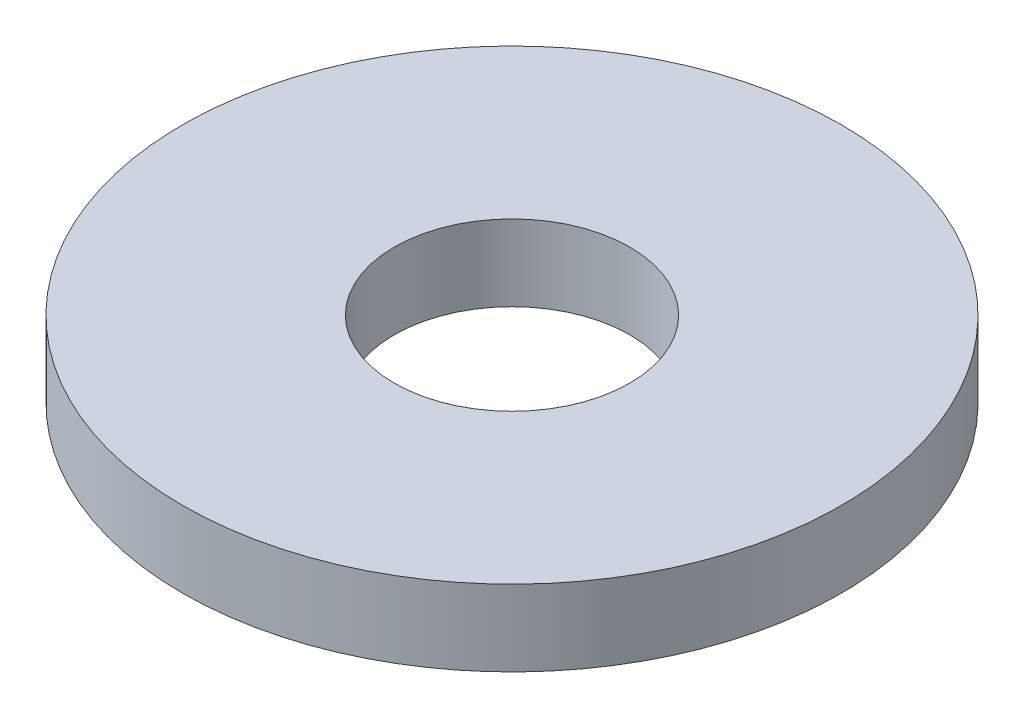
ISO-10303-21;
HEADER;
FILE_DESCRIPTION(('STEP AP214'),'2;1');
FILE_NAME('part.step','',(''),(''),'','','');
FILE_SCHEMA(('AUTOMOTIVE_DESIGN { 1 0 10303 214 1 1 1 1 }'));
ENDSEC;
DATA;
#1=APPLICATION_CONTEXT('core data for automotive mechanical design processes');
#2=APPLICATION_PROTOCOL_DEFINITION('international standard','automotive_design',2000,#1);
#3=PRODUCT_CONTEXT('',#1,'mechanical');
#4=PRODUCT('Part','Part','',(#3));
#5=PRODUCT_RELATED_PRODUCT_CATEGORY('part','',(#4));
#6=PRODUCT_DEFINITION_FORMATION('','',#4);
#7=PRODUCT_DEFINITION_CONTEXT('part definition',#1,'design');
#8=PRODUCT_DEFINITION('design','',#6,#7);
#9=PRODUCT_DEFINITION_SHAPE('','',#8);
#10=(LENGTH_UNIT() NAMED_UNIT(*) SI_UNIT(.MILLI.,.METRE.));
#11=(NAMED_UNIT(*) PLANE_ANGLE_UNIT() SI_UNIT($,.RADIAN.));
#12=(NAMED_UNIT(*) SI_UNIT($,.STERADIAN.) SOLID_ANGLE_UNIT());
#13=UNCERTAINTY_MEASURE_WITH_UNIT(LENGTH_MEASURE(1.E-05),#10,'distance_accuracy_value','');
#14=(GEOMETRIC_REPRESENTATION_CONTEXT(3) GLOBAL_UNCERTAINTY_ASSIGNED_CONTEXT((#13)) GLOBAL_UNIT_ASSIGNED_CONTEXT((#10,
#11,#12)) REPRESENTATION_CONTEXT('',''));
#15=CARTESIAN_POINT('',(0.,0.,0.));
#16=DIRECTION('',(0.,0.,1.));
#17=DIRECTION('',(1.,0.,0.));
#18=AXIS2_PLACEMENT_3D('',#15,#16,#17);
#19=CARTESIAN_POINT('',(0.,2.54,0.));
#20=DIRECTION('',(0.,1.,0.));
#21=DIRECTION('',(0.,0.,1.));
#22=AXIS2_PLACEMENT_3D('',#19,#20,#21);
#23=PLANE('',#22);
#24=CARTESIAN_POINT('',(0.,2.54,0.));
#25=DIRECTION('',(0.,1.,0.));
#26=DIRECTION('',(0.,0.,1.));
#27=AXIS2_PLACEMENT_3D('',#24,#25,#26);
#28=CIRCLE('',#27,11.0109);
#29=CARTESIAN_POINT('',(0.,2.54,11.0109));
#30=VERTEX_POINT('',#29);
#31=EDGE_CURVE('E10',#30,#30,#28,.T.);
#32=ORIENTED_EDGE('',*,*,#31,.T.);
#33=EDGE_LOOP('',(#32));
#34=FACE_BOUND('',#33,.T.);
#35=CARTESIAN_POINT('',(0.,2.54,0.));
#36=DIRECTION('',(0.,1.,0.));
#37=DIRECTION('',(0.,0.,1.));
#38=AXIS2_PLACEMENT_3D('',#35,#36,#37);
#39=CIRCLE('',#38,3.937);
#40=CARTESIAN_POINT('',(0.,2.54,3.937));
#41=VERTEX_POINT('',#40);
#42=EDGE_CURVE('E41',#41,#41,#39,.T.);
#43=ORIENTED_EDGE('',*,*,#42,.F.);
#44=EDGE_LOOP('',(#43));
#45=FACE_BOUND('',#44,.T.);
#46=ADVANCED_FACE('F30',(#34,#45),#23,.T.);
#47=CARTESIAN_POINT('',(0.,0.,0.));
#48=DIRECTION('',(0.,1.,0.));
#49=DIRECTION('',(0.,0.,1.));
#50=AXIS2_PLACEMENT_3D('',#47,#48,#49);
#51=PLANE('',#50);
#52=CARTESIAN_POINT('',(0.,0.,0.));
#53=DIRECTION('',(0.,1.,0.));
#54=DIRECTION('',(0.,0.,1.));
#55=AXIS2_PLACEMENT_3D('',#52,#53,#54);
#56=CIRCLE('',#55,11.0109);
#57=CARTESIAN_POINT('',(0.,0.,11.0109));
#58=VERTEX_POINT('',#57);
#59=EDGE_CURVE('E34',#58,#58,#56,.T.);
#60=ORIENTED_EDGE('',*,*,#59,.F.);
#61=EDGE_LOOP('',(#60));
#62=FACE_BOUND('',#61,.T.);
#63=CARTESIAN_POINT('',(0.,0.,0.));
#64=DIRECTION('',(0.,1.,0.));
#65=DIRECTION('',(0.,0.,1.));
#66=AXIS2_PLACEMENT_3D('',#63,#64,#65);
#67=CIRCLE('',#66,3.937);
#68=CARTESIAN_POINT('',(0.,0.,3.937));
#69=VERTEX_POINT('',#68);
#70=EDGE_CURVE('E43',#69,#69,#67,.T.);
#71=ORIENTED_EDGE('',*,*,#70,.T.);
#72=EDGE_LOOP('',(#71));
#73=FACE_BOUND('',#72,.T.);
#74=ADVANCED_FACE('F53',(#62,#73),#51,.F.);
#75=CARTESIAN_POINT('',(0.,2.54,0.));
#76=DIRECTION('',(0.,-1.,0.));
#77=DIRECTION('',(0.,0.,-1.));
#78=AXIS2_PLACEMENT_3D('',#75,#76,#77);
#79=CYLINDRICAL_SURFACE('',#78,11.0109);
#80=ORIENTED_EDGE('',*,*,#31,.F.);
#81=EDGE_LOOP('',(#80));
#82=FACE_BOUND('',#81,.T.);
#83=ORIENTED_EDGE('',*,*,#59,.T.);
#84=EDGE_LOOP('',(#83));
#85=FACE_BOUND('',#84,.T.);
#86=ADVANCED_FACE('F32',(#82,#85),#79,.T.);
#87=CARTESIAN_POINT('',(0.,2.54,0.));
#88=DIRECTION('',(0.,-1.,0.));
#89=DIRECTION('',(0.,0.,-1.));
#90=AXIS2_PLACEMENT_3D('',#87,#88,#89);
#91=CYLINDRICAL_SURFACE('',#90,3.937);
#92=ORIENTED_EDGE('',*,*,#42,.T.);
#93=EDGE_LOOP('',(#92));
#94=FACE_BOUND('',#93,.T.);
#95=ORIENTED_EDGE('',*,*,#70,.F.);
#96=EDGE_LOOP('',(#95));
#97=FACE_BOUND('',#96,.T.);
#98=ADVANCED_FACE('F49',(#94,#97),#91,.F.);
#99=CLOSED_SHELL('',(#46,#74,#86,#98));
#100=MANIFOLD_SOLID_BREP('B2',#99);
#101=ADVANCED_BREP_SHAPE_REPRESENTATION('',(#18,#100),#14);
#102=SHAPE_DEFINITION_REPRESENTATION(#9,#101);
ENDSEC;
END-ISO-10303-21;
